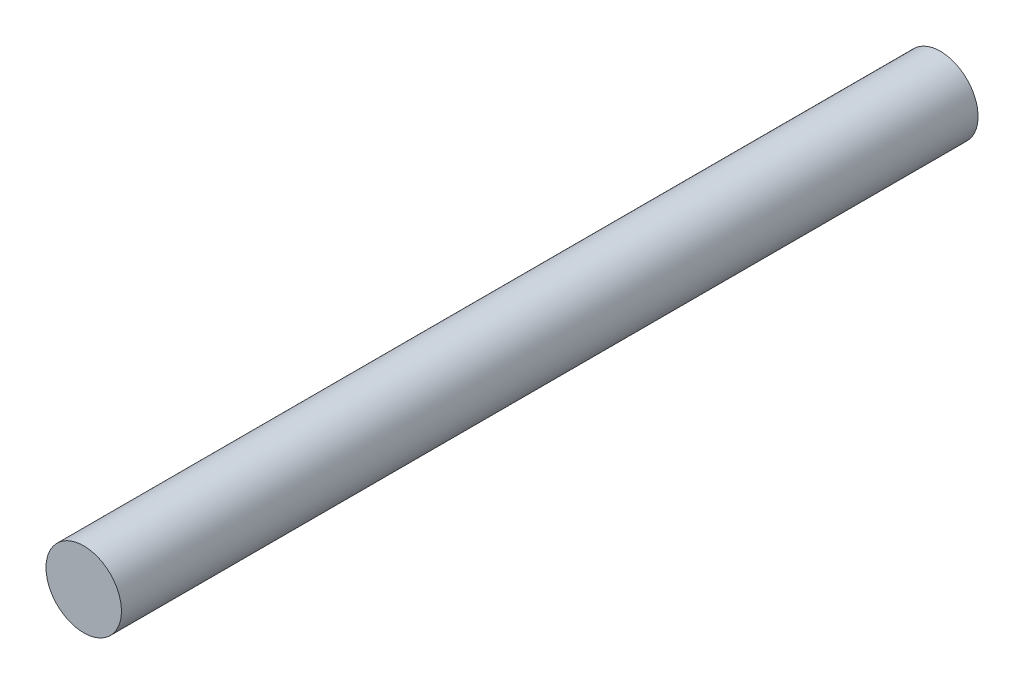
ISO-10303-21;
HEADER;
FILE_DESCRIPTION(('STEP AP214'),'2;1');
FILE_NAME('part.step','',(''),(''),'','','');
FILE_SCHEMA(('AUTOMOTIVE_DESIGN { 1 0 10303 214 1 1 1 1 }'));
ENDSEC;
DATA;
#1=APPLICATION_CONTEXT('core data for automotive mechanical design processes');
#2=APPLICATION_PROTOCOL_DEFINITION('international standard','automotive_design',2000,#1);
#3=PRODUCT_CONTEXT('',#1,'mechanical');
#4=PRODUCT('Part','Part','',(#3));
#5=PRODUCT_RELATED_PRODUCT_CATEGORY('part','',(#4));
#6=PRODUCT_DEFINITION_FORMATION('','',#4);
#7=PRODUCT_DEFINITION_CONTEXT('part definition',#1,'design');
#8=PRODUCT_DEFINITION('design','',#6,#7);
#9=PRODUCT_DEFINITION_SHAPE('','',#8);
#10=(LENGTH_UNIT() NAMED_UNIT(*) SI_UNIT(.MILLI.,.METRE.));
#11=(NAMED_UNIT(*) PLANE_ANGLE_UNIT() SI_UNIT($,.RADIAN.));
#12=(NAMED_UNIT(*) SI_UNIT($,.STERADIAN.) SOLID_ANGLE_UNIT());
#13=UNCERTAINTY_MEASURE_WITH_UNIT(LENGTH_MEASURE(1.E-05),#10,'distance_accuracy_value','');
#14=(GEOMETRIC_REPRESENTATION_CONTEXT(3) GLOBAL_UNCERTAINTY_ASSIGNED_CONTEXT((#13)) GLOBAL_UNIT_ASSIGNED_CONTEXT((#10,
#11,#12)) REPRESENTATION_CONTEXT('',''));
#15=CARTESIAN_POINT('',(0.,0.,0.));
#16=DIRECTION('',(0.,0.,1.));
#17=DIRECTION('',(1.,0.,0.));
#18=AXIS2_PLACEMENT_3D('',#15,#16,#17);
#19=CARTESIAN_POINT('',(0.,0.,79.5));
#20=DIRECTION('',(0.,0.,-1.));
#21=DIRECTION('',(-1.,0.,0.));
#22=AXIS2_PLACEMENT_3D('',#19,#20,#21);
#23=CYLINDRICAL_SURFACE('',#22,3.5);
#24=CARTESIAN_POINT('',(0.,0.,79.5));
#25=DIRECTION('',(0.,0.,1.));
#26=DIRECTION('',(1.,0.,0.));
#27=AXIS2_PLACEMENT_3D('',#24,#25,#26);
#28=CIRCLE('',#27,3.5);
#29=CARTESIAN_POINT('',(-3.5,0.,79.5));
#30=VERTEX_POINT('',#29);
#31=EDGE_CURVE('E10',#30,#30,#28,.T.);
#32=CARTESIAN_POINT('',(0.,0.,0.));
#33=DIRECTION('',(0.,0.,1.));
#34=DIRECTION('',(1.,0.,0.));
#35=AXIS2_PLACEMENT_3D('',#32,#33,#34);
#36=CIRCLE('',#35,3.5);
#37=CARTESIAN_POINT('',(-3.5,0.,0.));
#38=VERTEX_POINT('',#37);
#39=EDGE_CURVE('E36',#38,#38,#36,.T.);
#40=CARTESIAN_POINT('',(-3.5,0.,79.5));
#41=CARTESIAN_POINT('',(-3.5,0.,78.671875));
#42=CARTESIAN_POINT('',(-3.5,0.,77.84375));
#43=CARTESIAN_POINT('',(-3.5,0.,76.1875));
#44=CARTESIAN_POINT('',(-3.5,0.,75.359375));
#45=CARTESIAN_POINT('',(-3.5,0.,73.703125));
#46=CARTESIAN_POINT('',(-3.5,0.,72.875));
#47=CARTESIAN_POINT('',(-3.5,0.,71.21875));
#48=CARTESIAN_POINT('',(-3.5,0.,70.390625));
#49=CARTESIAN_POINT('',(-3.5,0.,68.734375));
#50=CARTESIAN_POINT('',(-3.5,0.,67.90625));
#51=CARTESIAN_POINT('',(-3.5,0.,66.25));
#52=CARTESIAN_POINT('',(-3.5,0.,65.421875));
#53=CARTESIAN_POINT('',(-3.5,0.,63.765625));
#54=CARTESIAN_POINT('',(-3.5,0.,62.9375));
#55=CARTESIAN_POINT('',(-3.5,0.,61.28125));
#56=CARTESIAN_POINT('',(-3.5,0.,60.453125));
#57=CARTESIAN_POINT('',(-3.5,0.,58.796875));
#58=CARTESIAN_POINT('',(-3.5,0.,57.96875));
#59=CARTESIAN_POINT('',(-3.5,0.,56.3125));
#60=CARTESIAN_POINT('',(-3.5,0.,55.484375));
#61=CARTESIAN_POINT('',(-3.5,0.,53.828125));
#62=CARTESIAN_POINT('',(-3.5,0.,53.));
#63=CARTESIAN_POINT('',(-3.5,0.,51.34375));
#64=CARTESIAN_POINT('',(-3.5,0.,50.515625));
#65=CARTESIAN_POINT('',(-3.5,0.,48.859375));
#66=CARTESIAN_POINT('',(-3.5,0.,48.03125));
#67=CARTESIAN_POINT('',(-3.5,0.,46.375));
#68=CARTESIAN_POINT('',(-3.5,0.,45.546875));
#69=CARTESIAN_POINT('',(-3.5,0.,43.890625));
#70=CARTESIAN_POINT('',(-3.5,0.,43.0625));
#71=CARTESIAN_POINT('',(-3.5,0.,41.40625));
#72=CARTESIAN_POINT('',(-3.5,0.,40.578125));
#73=CARTESIAN_POINT('',(-3.5,0.,38.921875));
#74=CARTESIAN_POINT('',(-3.5,0.,38.09375));
#75=CARTESIAN_POINT('',(-3.5,0.,36.4375));
#76=CARTESIAN_POINT('',(-3.5,0.,35.609375));
#77=CARTESIAN_POINT('',(-3.5,0.,33.953125));
#78=CARTESIAN_POINT('',(-3.5,0.,33.125));
#79=CARTESIAN_POINT('',(-3.5,0.,31.46875));
#80=CARTESIAN_POINT('',(-3.5,0.,30.640625));
#81=CARTESIAN_POINT('',(-3.5,0.,28.984375));
#82=CARTESIAN_POINT('',(-3.5,0.,28.15625));
#83=CARTESIAN_POINT('',(-3.5,0.,26.5));
#84=CARTESIAN_POINT('',(-3.5,0.,25.671875));
#85=CARTESIAN_POINT('',(-3.5,0.,24.015625));
#86=CARTESIAN_POINT('',(-3.5,0.,23.1875));
#87=CARTESIAN_POINT('',(-3.5,0.,21.53125));
#88=CARTESIAN_POINT('',(-3.5,0.,20.703125));
#89=CARTESIAN_POINT('',(-3.5,0.,19.046875));
#90=CARTESIAN_POINT('',(-3.5,0.,18.21875));
#91=CARTESIAN_POINT('',(-3.5,0.,16.5625));
#92=CARTESIAN_POINT('',(-3.5,0.,15.734375));
#93=CARTESIAN_POINT('',(-3.5,0.,14.078125));
#94=CARTESIAN_POINT('',(-3.5,0.,13.25));
#95=CARTESIAN_POINT('',(-3.5,0.,11.59375));
#96=CARTESIAN_POINT('',(-3.5,0.,10.765625));
#97=CARTESIAN_POINT('',(-3.5,0.,9.109375));
#98=CARTESIAN_POINT('',(-3.5,0.,8.28125));
#99=CARTESIAN_POINT('',(-3.5,0.,6.625));
#100=CARTESIAN_POINT('',(-3.5,0.,5.796875));
#101=CARTESIAN_POINT('',(-3.5,0.,4.14062499999999));
#102=CARTESIAN_POINT('',(-3.5,0.,3.3125));
#103=CARTESIAN_POINT('',(-3.5,0.,1.65625));
#104=CARTESIAN_POINT('',(-3.5,0.,0.828124999999998));
#105=CARTESIAN_POINT('',(-3.5,0.,0.));
#106=B_SPLINE_CURVE_WITH_KNOTS('',3,(#40,#41,#42,#43,#44,#45,#46,#47,#48,#49,#50,#51,#52,#53,
#54,#55,#56,#57,#58,#59,#60,#61,#62,#63,#64,#65,#66,#67,#68,#69,#70,#71,#72,#73,#74,#75,#76,#77,
#78,#79,#80,#81,#82,#83,#84,#85,#86,#87,#88,#89,#90,#91,#92,#93,#94,#95,#96,#97,#98,#99,#100,
#101,#102,#103,#104,#105),.UNSPECIFIED.,.F.,.F.,(4,2,2,2,2,2,2,2,2,2,2,2,2,2,2,2,2,2,2,2,2,2,2,
2,2,2,2,2,2,2,2,2,4),(0.,2.48437500000001,4.96875000000001,7.45312500000001,9.9375,12.421875,
14.90625,17.390625,19.875,22.359375,24.84375,27.328125,29.8125,32.296875,34.78125,37.265625,
39.75,42.234375,44.71875,47.203125,49.6875,52.171875,54.65625,57.140625,59.625,62.109375,
64.59375,67.078125,69.5625,72.046875,74.53125,77.015625,79.5),.UNSPECIFIED.);
#107=EDGE_CURVE('BSEAM33',#30,#38,#106,.T.);
#108=ORIENTED_EDGE('',*,*,#31,.F.);
#109=ORIENTED_EDGE('',*,*,#39,.T.);
#110=ORIENTED_EDGE('',*,*,#107,.T.);
#111=ORIENTED_EDGE('',*,*,#107,.F.);
#112=EDGE_LOOP('',(#108,#110,#109,#111));
#113=FACE_BOUND('',#112,.T.);
#114=ADVANCED_FACE('F33',(#113),#23,.T.);
#115=CARTESIAN_POINT('',(0.,0.,79.5));
#116=DIRECTION('',(0.,0.,1.));
#117=DIRECTION('',(1.,0.,0.));
#118=AXIS2_PLACEMENT_3D('',#115,#116,#117);
#119=PLANE('',#118);
#120=ORIENTED_EDGE('',*,*,#31,.T.);
#121=EDGE_LOOP('',(#120));
#122=FACE_BOUND('',#121,.T.);
#123=ADVANCED_FACE('F48',(#122),#119,.T.);
#124=CARTESIAN_POINT('',(0.,0.,0.));
#125=DIRECTION('',(0.,0.,1.));
#126=DIRECTION('',(1.,0.,0.));
#127=AXIS2_PLACEMENT_3D('',#124,#125,#126);
#128=PLANE('',#127);
#129=ORIENTED_EDGE('',*,*,#39,.F.);
#130=EDGE_LOOP('',(#129));
#131=FACE_BOUND('',#130,.T.);
#132=ADVANCED_FACE('F46',(#131),#128,.F.);
#133=CLOSED_SHELL('',(#114,#123,#132));
#134=MANIFOLD_SOLID_BREP('B2',#133);
#135=ADVANCED_BREP_SHAPE_REPRESENTATION('',(#18,#134),#14);
#136=SHAPE_DEFINITION_REPRESENTATION(#9,#135);
ENDSEC;
END-ISO-10303-21;
